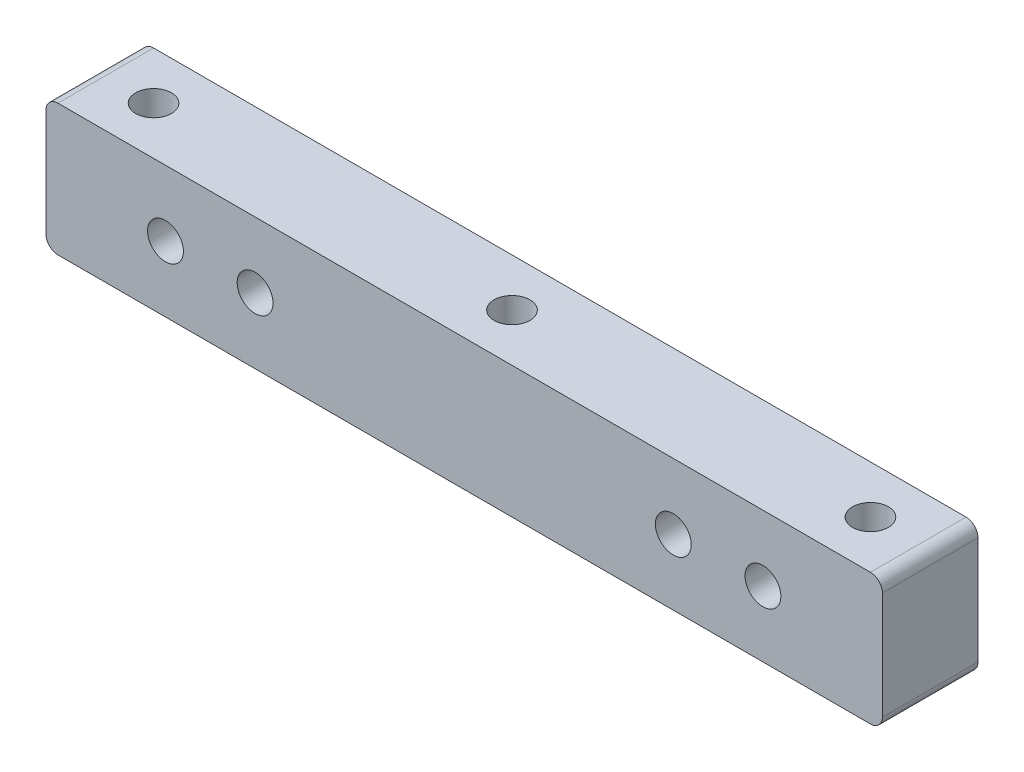
ISO-10303-21;
HEADER;
FILE_DESCRIPTION(('STEP AP214'),'2;1');
FILE_NAME('part.step','',(''),(''),'','','');
FILE_SCHEMA(('AUTOMOTIVE_DESIGN { 1 0 10303 214 1 1 1 1 }'));
ENDSEC;
DATA;
#1=APPLICATION_CONTEXT('core data for automotive mechanical design processes');
#2=APPLICATION_PROTOCOL_DEFINITION('international standard','automotive_design',2000,#1);
#3=PRODUCT_CONTEXT('',#1,'mechanical');
#4=PRODUCT('Part','Part','',(#3));
#5=PRODUCT_RELATED_PRODUCT_CATEGORY('part','',(#4));
#6=PRODUCT_DEFINITION_FORMATION('','',#4);
#7=PRODUCT_DEFINITION_CONTEXT('part definition',#1,'design');
#8=PRODUCT_DEFINITION('design','',#6,#7);
#9=PRODUCT_DEFINITION_SHAPE('','',#8);
#10=(LENGTH_UNIT() NAMED_UNIT(*) SI_UNIT(.MILLI.,.METRE.));
#11=(NAMED_UNIT(*) PLANE_ANGLE_UNIT() SI_UNIT($,.RADIAN.));
#12=(NAMED_UNIT(*) SI_UNIT($,.STERADIAN.) SOLID_ANGLE_UNIT());
#13=UNCERTAINTY_MEASURE_WITH_UNIT(LENGTH_MEASURE(1.E-05),#10,'distance_accuracy_value','');
#14=(GEOMETRIC_REPRESENTATION_CONTEXT(3) GLOBAL_UNCERTAINTY_ASSIGNED_CONTEXT((#13)) GLOBAL_UNIT_ASSIGNED_CONTEXT((#10,
#11,#12)) REPRESENTATION_CONTEXT('',''));
#15=CARTESIAN_POINT('',(0.,0.,0.));
#16=DIRECTION('',(0.,0.,1.));
#17=DIRECTION('',(1.,0.,0.));
#18=AXIS2_PLACEMENT_3D('',#15,#16,#17);
#19=CARTESIAN_POINT('',(70.,11.,16.));
#20=DIRECTION('',(-1.,0.,0.));
#21=DIRECTION('',(0.,0.,1.));
#22=AXIS2_PLACEMENT_3D('',#19,#20,#21);
#23=PLANE('',#22);
#24=DIRECTION('',(0.,1.,0.));
#25=VECTOR('',#24,1.);
#26=CARTESIAN_POINT('',(70.,11.,0.));
#27=LINE('',#26,#25);
#28=CARTESIAN_POINT('',(70.,-9.,0.));
#29=VERTEX_POINT('',#28);
#30=CARTESIAN_POINT('',(70.,9.,0.));
#31=VERTEX_POINT('',#30);
#32=EDGE_CURVE('E168',#29,#31,#27,.T.);
#33=ORIENTED_EDGE('',*,*,#32,.T.);
#34=DIRECTION('',(0.,0.,-1.));
#35=VECTOR('',#34,1.);
#36=CARTESIAN_POINT('',(70.,9.,16.));
#37=LINE('',#36,#35);
#38=CARTESIAN_POINT('',(70.,9.,16.));
#39=VERTEX_POINT('',#38);
#40=EDGE_CURVE('E56',#31,#39,#37,.F.);
#41=ORIENTED_EDGE('',*,*,#40,.T.);
#42=DIRECTION('',(0.,1.,0.));
#43=VECTOR('',#42,1.);
#44=CARTESIAN_POINT('',(70.,11.,16.));
#45=LINE('',#44,#43);
#46=CARTESIAN_POINT('',(70.,-9.,16.));
#47=VERTEX_POINT('',#46);
#48=EDGE_CURVE('E123',#47,#39,#45,.T.);
#49=ORIENTED_EDGE('',*,*,#48,.F.);
#50=DIRECTION('',(0.,0.,-1.));
#51=VECTOR('',#50,1.);
#52=CARTESIAN_POINT('',(70.,-9.,16.));
#53=LINE('',#52,#51);
#54=EDGE_CURVE('E150',#47,#29,#53,.T.);
#55=ORIENTED_EDGE('',*,*,#54,.T.);
#56=EDGE_LOOP('',(#33,#41,#49,#55));
#57=FACE_BOUND('',#56,.T.);
#58=ADVANCED_FACE('F35',(#57),#23,.F.);
#59=CARTESIAN_POINT('',(-70.,11.,16.));
#60=DIRECTION('',(0.,-1.,0.));
#61=DIRECTION('',(0.,0.,-1.));
#62=AXIS2_PLACEMENT_3D('',#59,#60,#61);
#63=PLANE('',#62);
#64=CARTESIAN_POINT('',(60.,11.,7.99999999999999));
#65=DIRECTION('',(0.,1.,0.));
#66=DIRECTION('',(0.,0.,1.));
#67=AXIS2_PLACEMENT_3D('',#64,#65,#66);
#68=CIRCLE('',#67,2.99999999999999);
#69=CARTESIAN_POINT('',(60.,11.,11.));
#70=VERTEX_POINT('',#69);
#71=EDGE_CURVE('E212',#70,#70,#68,.T.);
#72=ORIENTED_EDGE('',*,*,#71,.F.);
#73=EDGE_LOOP('',(#72));
#74=FACE_BOUND('',#73,.T.);
#75=CARTESIAN_POINT('',(-60.,11.,7.99999999999999));
#76=DIRECTION('',(0.,1.,0.));
#77=DIRECTION('',(0.,0.,-1.));
#78=AXIS2_PLACEMENT_3D('',#75,#76,#77);
#79=CIRCLE('',#78,2.99999999999999);
#80=CARTESIAN_POINT('',(-60.,11.,5.));
#81=VERTEX_POINT('',#80);
#82=EDGE_CURVE('E206',#81,#81,#79,.T.);
#83=ORIENTED_EDGE('',*,*,#82,.F.);
#84=EDGE_LOOP('',(#83));
#85=FACE_BOUND('',#84,.T.);
#86=CARTESIAN_POINT('',(0.,11.,7.99999999999999));
#87=DIRECTION('',(0.,1.,0.));
#88=DIRECTION('',(0.,0.,1.));
#89=AXIS2_PLACEMENT_3D('',#86,#87,#88);
#90=CIRCLE('',#89,3.);
#91=CARTESIAN_POINT('',(0.,11.,11.));
#92=VERTEX_POINT('',#91);
#93=EDGE_CURVE('E200',#92,#92,#90,.T.);
#94=ORIENTED_EDGE('',*,*,#93,.F.);
#95=EDGE_LOOP('',(#94));
#96=FACE_BOUND('',#95,.T.);
#97=DIRECTION('',(-1.,0.,0.));
#98=VECTOR('',#97,1.);
#99=CARTESIAN_POINT('',(-70.,11.,16.));
#100=LINE('',#99,#98);
#101=CARTESIAN_POINT('',(68.,11.,16.));
#102=VERTEX_POINT('',#101);
#103=CARTESIAN_POINT('',(-68.,11.,16.));
#104=VERTEX_POINT('',#103);
#105=EDGE_CURVE('E126',#102,#104,#100,.T.);
#106=ORIENTED_EDGE('',*,*,#105,.F.);
#107=DIRECTION('',(0.,0.,-1.));
#108=VECTOR('',#107,1.);
#109=CARTESIAN_POINT('',(68.,11.,16.));
#110=LINE('',#109,#108);
#111=CARTESIAN_POINT('',(68.,11.,0.));
#112=VERTEX_POINT('',#111);
#113=EDGE_CURVE('E144',#102,#112,#110,.T.);
#114=ORIENTED_EDGE('',*,*,#113,.T.);
#115=DIRECTION('',(-1.,0.,0.));
#116=VECTOR('',#115,1.);
#117=CARTESIAN_POINT('',(-70.,11.,0.));
#118=LINE('',#117,#116);
#119=CARTESIAN_POINT('',(-68.,11.,0.));
#120=VERTEX_POINT('',#119);
#121=EDGE_CURVE('E128',#112,#120,#118,.T.);
#122=ORIENTED_EDGE('',*,*,#121,.T.);
#123=DIRECTION('',(0.,0.,-1.));
#124=VECTOR('',#123,1.);
#125=CARTESIAN_POINT('',(-68.,11.,16.));
#126=LINE('',#125,#124);
#127=EDGE_CURVE('E141',#120,#104,#126,.F.);
#128=ORIENTED_EDGE('',*,*,#127,.T.);
#129=EDGE_LOOP('',(#106,#114,#122,#128));
#130=FACE_BOUND('',#129,.T.);
#131=ADVANCED_FACE('F162',(#74,#85,#96,#130),#63,.F.);
#132=CARTESIAN_POINT('',(-70.,11.,16.));
#133=DIRECTION('',(1.,0.,0.));
#134=DIRECTION('',(0.,0.,-1.));
#135=AXIS2_PLACEMENT_3D('',#132,#133,#134);
#136=PLANE('',#135);
#137=DIRECTION('',(0.,-1.,0.));
#138=VECTOR('',#137,1.);
#139=CARTESIAN_POINT('',(-70.,11.,0.));
#140=LINE('',#139,#138);
#141=CARTESIAN_POINT('',(-70.,9.,0.));
#142=VERTEX_POINT('',#141);
#143=CARTESIAN_POINT('',(-70.,-9.,0.));
#144=VERTEX_POINT('',#143);
#145=EDGE_CURVE('E124',#142,#144,#140,.T.);
#146=ORIENTED_EDGE('',*,*,#145,.T.);
#147=DIRECTION('',(0.,0.,-1.));
#148=VECTOR('',#147,1.);
#149=CARTESIAN_POINT('',(-70.,-9.,16.));
#150=LINE('',#149,#148);
#151=CARTESIAN_POINT('',(-70.,-9.,16.));
#152=VERTEX_POINT('',#151);
#153=EDGE_CURVE('E107',#144,#152,#150,.F.);
#154=ORIENTED_EDGE('',*,*,#153,.T.);
#155=DIRECTION('',(0.,-1.,0.));
#156=VECTOR('',#155,1.);
#157=CARTESIAN_POINT('',(-70.,11.,16.));
#158=LINE('',#157,#156);
#159=CARTESIAN_POINT('',(-70.,9.,16.));
#160=VERTEX_POINT('',#159);
#161=EDGE_CURVE('E165',#160,#152,#158,.T.);
#162=ORIENTED_EDGE('',*,*,#161,.F.);
#163=DIRECTION('',(0.,0.,-1.));
#164=VECTOR('',#163,1.);
#165=CARTESIAN_POINT('',(-70.,9.,16.));
#166=LINE('',#165,#164);
#167=EDGE_CURVE('E112',#160,#142,#166,.T.);
#168=ORIENTED_EDGE('',*,*,#167,.T.);
#169=EDGE_LOOP('',(#146,#154,#162,#168));
#170=FACE_BOUND('',#169,.T.);
#171=ADVANCED_FACE('F229',(#170),#136,.F.);
#172=CARTESIAN_POINT('',(-70.,-11.,16.));
#173=DIRECTION('',(0.,1.,0.));
#174=DIRECTION('',(0.,0.,1.));
#175=AXIS2_PLACEMENT_3D('',#172,#173,#174);
#176=PLANE('',#175);
#177=CARTESIAN_POINT('',(60.,-11.,7.99999999999999));
#178=DIRECTION('',(0.,1.,0.));
#179=DIRECTION('',(0.,0.,1.));
#180=AXIS2_PLACEMENT_3D('',#177,#178,#179);
#181=CIRCLE('',#180,2.99999999999999);
#182=CARTESIAN_POINT('',(60.,-11.,11.));
#183=VERTEX_POINT('',#182);
#184=EDGE_CURVE('E209',#183,#183,#181,.T.);
#185=ORIENTED_EDGE('',*,*,#184,.T.);
#186=EDGE_LOOP('',(#185));
#187=FACE_BOUND('',#186,.T.);
#188=CARTESIAN_POINT('',(-60.,-11.,7.99999999999999));
#189=DIRECTION('',(0.,1.,0.));
#190=DIRECTION('',(0.,0.,-1.));
#191=AXIS2_PLACEMENT_3D('',#188,#189,#190);
#192=CIRCLE('',#191,2.99999999999999);
#193=CARTESIAN_POINT('',(-60.,-11.,5.));
#194=VERTEX_POINT('',#193);
#195=EDGE_CURVE('E203',#194,#194,#192,.T.);
#196=ORIENTED_EDGE('',*,*,#195,.T.);
#197=EDGE_LOOP('',(#196));
#198=FACE_BOUND('',#197,.T.);
#199=CARTESIAN_POINT('',(0.,-11.,7.99999999999999));
#200=DIRECTION('',(0.,1.,0.));
#201=DIRECTION('',(0.,0.,1.));
#202=AXIS2_PLACEMENT_3D('',#199,#200,#201);
#203=CIRCLE('',#202,3.);
#204=CARTESIAN_POINT('',(0.,-11.,11.));
#205=VERTEX_POINT('',#204);
#206=EDGE_CURVE('E199',#205,#205,#203,.T.);
#207=ORIENTED_EDGE('',*,*,#206,.T.);
#208=EDGE_LOOP('',(#207));
#209=FACE_BOUND('',#208,.T.);
#210=DIRECTION('',(1.,0.,0.));
#211=VECTOR('',#210,1.);
#212=CARTESIAN_POINT('',(-70.,-11.,0.));
#213=LINE('',#212,#211);
#214=CARTESIAN_POINT('',(-68.,-11.,0.));
#215=VERTEX_POINT('',#214);
#216=CARTESIAN_POINT('',(68.,-11.,0.));
#217=VERTEX_POINT('',#216);
#218=EDGE_CURVE('E116',#215,#217,#213,.T.);
#219=ORIENTED_EDGE('',*,*,#218,.T.);
#220=DIRECTION('',(0.,0.,-1.));
#221=VECTOR('',#220,1.);
#222=CARTESIAN_POINT('',(68.,-11.,16.));
#223=LINE('',#222,#221);
#224=CARTESIAN_POINT('',(68.,-11.,16.));
#225=VERTEX_POINT('',#224);
#226=EDGE_CURVE('E12',#217,#225,#223,.F.);
#227=ORIENTED_EDGE('',*,*,#226,.T.);
#228=DIRECTION('',(1.,0.,0.));
#229=VECTOR('',#228,1.);
#230=CARTESIAN_POINT('',(-70.,-11.,16.));
#231=LINE('',#230,#229);
#232=CARTESIAN_POINT('',(-68.,-11.,16.));
#233=VERTEX_POINT('',#232);
#234=EDGE_CURVE('E117',#233,#225,#231,.T.);
#235=ORIENTED_EDGE('',*,*,#234,.F.);
#236=DIRECTION('',(0.,0.,-1.));
#237=VECTOR('',#236,1.);
#238=CARTESIAN_POINT('',(-68.,-11.,16.));
#239=LINE('',#238,#237);
#240=EDGE_CURVE('E106',#233,#215,#239,.T.);
#241=ORIENTED_EDGE('',*,*,#240,.T.);
#242=EDGE_LOOP('',(#219,#227,#235,#241));
#243=FACE_BOUND('',#242,.T.);
#244=ADVANCED_FACE('F115',(#187,#198,#209,#243),#176,.F.);
#245=CARTESIAN_POINT('',(0.,0.,16.));
#246=DIRECTION('',(0.,0.,1.));
#247=DIRECTION('',(1.,0.,0.));
#248=AXIS2_PLACEMENT_3D('',#245,#246,#247);
#249=PLANE('',#248);
#250=CARTESIAN_POINT('',(-50.,-2.09488880330588E-13,16.));
#251=DIRECTION('',(0.,0.,1.));
#252=DIRECTION('',(-1.,0.,0.));
#253=AXIS2_PLACEMENT_3D('',#250,#251,#252);
#254=CIRCLE('',#253,2.99999999999999);
#255=CARTESIAN_POINT('',(-52.9999999999999,-2.09488880330588E-13,16.));
#256=VERTEX_POINT('',#255);
#257=EDGE_CURVE('E196',#256,#256,#254,.T.);
#258=ORIENTED_EDGE('',*,*,#257,.F.);
#259=EDGE_LOOP('',(#258));
#260=FACE_BOUND('',#259,.T.);
#261=CARTESIAN_POINT('',(-35.,-1.04744440165294E-13,16.));
#262=DIRECTION('',(0.,0.,1.));
#263=DIRECTION('',(-1.,0.,0.));
#264=AXIS2_PLACEMENT_3D('',#261,#262,#263);
#265=CIRCLE('',#264,2.99999999999999);
#266=CARTESIAN_POINT('',(-37.9999999999999,-1.04744440165294E-13,16.));
#267=VERTEX_POINT('',#266);
#268=EDGE_CURVE('E190',#267,#267,#265,.T.);
#269=ORIENTED_EDGE('',*,*,#268,.F.);
#270=EDGE_LOOP('',(#269));
#271=FACE_BOUND('',#270,.T.);
#272=CARTESIAN_POINT('',(50.,-1.04744440165294E-13,16.));
#273=DIRECTION('',(0.,0.,1.));
#274=DIRECTION('',(1.,0.,0.));
#275=AXIS2_PLACEMENT_3D('',#272,#273,#274);
#276=CIRCLE('',#275,2.99999999999999);
#277=CARTESIAN_POINT('',(53.,-1.04744440165294E-13,16.));
#278=VERTEX_POINT('',#277);
#279=EDGE_CURVE('E184',#278,#278,#276,.T.);
#280=ORIENTED_EDGE('',*,*,#279,.F.);
#281=EDGE_LOOP('',(#280));
#282=FACE_BOUND('',#281,.T.);
#283=CARTESIAN_POINT('',(35.,-1.04744440165294E-13,16.));
#284=DIRECTION('',(0.,0.,1.));
#285=DIRECTION('',(1.,0.,0.));
#286=AXIS2_PLACEMENT_3D('',#283,#284,#285);
#287=CIRCLE('',#286,2.99999999999999);
#288=CARTESIAN_POINT('',(38.,-1.04744440165294E-13,16.));
#289=VERTEX_POINT('',#288);
#290=EDGE_CURVE('E173',#289,#289,#287,.T.);
#291=ORIENTED_EDGE('',*,*,#290,.F.);
#292=EDGE_LOOP('',(#291));
#293=FACE_BOUND('',#292,.T.);
#294=ORIENTED_EDGE('',*,*,#48,.T.);
#295=CARTESIAN_POINT('',(68.,9.,16.));
#296=DIRECTION('',(0.,0.,1.));
#297=DIRECTION('',(1.,0.,0.));
#298=AXIS2_PLACEMENT_3D('',#295,#296,#297);
#299=CIRCLE('',#298,2.);
#300=EDGE_CURVE('E43',#39,#102,#299,.T.);
#301=ORIENTED_EDGE('',*,*,#300,.T.);
#302=ORIENTED_EDGE('',*,*,#105,.T.);
#303=CARTESIAN_POINT('',(-68.,9.,16.));
#304=DIRECTION('',(0.,0.,1.));
#305=DIRECTION('',(1.,0.,0.));
#306=AXIS2_PLACEMENT_3D('',#303,#304,#305);
#307=CIRCLE('',#306,2.);
#308=EDGE_CURVE('E137',#104,#160,#307,.T.);
#309=ORIENTED_EDGE('',*,*,#308,.T.);
#310=ORIENTED_EDGE('',*,*,#161,.T.);
#311=CARTESIAN_POINT('',(-68.,-9.,16.));
#312=DIRECTION('',(0.,0.,1.));
#313=DIRECTION('',(1.,0.,0.));
#314=AXIS2_PLACEMENT_3D('',#311,#312,#313);
#315=CIRCLE('',#314,2.);
#316=EDGE_CURVE('E139',#152,#233,#315,.T.);
#317=ORIENTED_EDGE('',*,*,#316,.T.);
#318=ORIENTED_EDGE('',*,*,#234,.T.);
#319=CARTESIAN_POINT('',(68.,-9.,16.));
#320=DIRECTION('',(0.,0.,1.));
#321=DIRECTION('',(1.,0.,0.));
#322=AXIS2_PLACEMENT_3D('',#319,#320,#321);
#323=CIRCLE('',#322,2.);
#324=EDGE_CURVE('E154',#225,#47,#323,.T.);
#325=ORIENTED_EDGE('',*,*,#324,.T.);
#326=EDGE_LOOP('',(#294,#301,#302,#309,#310,#317,#318,#325));
#327=FACE_BOUND('',#326,.T.);
#328=ADVANCED_FACE('F158',(#260,#271,#282,#293,#327),#249,.T.);
#329=CARTESIAN_POINT('',(0.,0.,0.));
#330=DIRECTION('',(0.,0.,1.));
#331=DIRECTION('',(1.,0.,0.));
#332=AXIS2_PLACEMENT_3D('',#329,#330,#331);
#333=PLANE('',#332);
#334=ORIENTED_EDGE('',*,*,#121,.F.);
#335=CARTESIAN_POINT('',(68.,9.,0.));
#336=DIRECTION('',(0.,0.,1.));
#337=DIRECTION('',(1.,0.,0.));
#338=AXIS2_PLACEMENT_3D('',#335,#336,#337);
#339=CIRCLE('',#338,2.);
#340=EDGE_CURVE('E148',#112,#31,#339,.F.);
#341=ORIENTED_EDGE('',*,*,#340,.T.);
#342=ORIENTED_EDGE('',*,*,#32,.F.);
#343=CARTESIAN_POINT('',(68.,-9.,0.));
#344=DIRECTION('',(0.,0.,1.));
#345=DIRECTION('',(1.,0.,0.));
#346=AXIS2_PLACEMENT_3D('',#343,#344,#345);
#347=CIRCLE('',#346,2.);
#348=EDGE_CURVE('E122',#29,#217,#347,.F.);
#349=ORIENTED_EDGE('',*,*,#348,.T.);
#350=ORIENTED_EDGE('',*,*,#218,.F.);
#351=CARTESIAN_POINT('',(-68.,-9.,0.));
#352=DIRECTION('',(0.,0.,1.));
#353=DIRECTION('',(1.,0.,0.));
#354=AXIS2_PLACEMENT_3D('',#351,#352,#353);
#355=CIRCLE('',#354,2.);
#356=EDGE_CURVE('E102',#215,#144,#355,.F.);
#357=ORIENTED_EDGE('',*,*,#356,.T.);
#358=ORIENTED_EDGE('',*,*,#145,.F.);
#359=CARTESIAN_POINT('',(-68.,9.,0.));
#360=DIRECTION('',(0.,0.,1.));
#361=DIRECTION('',(1.,0.,0.));
#362=AXIS2_PLACEMENT_3D('',#359,#360,#361);
#363=CIRCLE('',#362,2.);
#364=EDGE_CURVE('E113',#142,#120,#363,.F.);
#365=ORIENTED_EDGE('',*,*,#364,.T.);
#366=EDGE_LOOP('',(#334,#341,#342,#349,#350,#357,#358,#365));
#367=FACE_BOUND('',#366,.T.);
#368=ADVANCED_FACE('F120',(#367),#333,.F.);
#369=CARTESIAN_POINT('',(35.,-1.04744440165294E-13,-8.48528137423855));
#370=DIRECTION('',(0.,0.,1.));
#371=DIRECTION('',(1.,0.,0.));
#372=AXIS2_PLACEMENT_3D('',#369,#370,#371);
#373=CYLINDRICAL_SURFACE('',#372,2.99999999999999);
#374=CARTESIAN_POINT('',(35.,-1.04744440165294E-13,0.200000000000001));
#375=DIRECTION('',(0.,0.,1.));
#376=DIRECTION('',(1.,0.,0.));
#377=AXIS2_PLACEMENT_3D('',#374,#375,#376);
#378=CIRCLE('',#377,2.99999999999999);
#379=CARTESIAN_POINT('',(38.,-1.04744440165294E-13,0.200000000000001));
#380=VERTEX_POINT('',#379);
#381=EDGE_CURVE('E170',#380,#380,#378,.F.);
#382=ORIENTED_EDGE('',*,*,#381,.T.);
#383=EDGE_LOOP('',(#382));
#384=FACE_BOUND('',#383,.T.);
#385=ORIENTED_EDGE('',*,*,#290,.T.);
#386=EDGE_LOOP('',(#385));
#387=FACE_BOUND('',#386,.T.);
#388=ADVANCED_FACE('F280',(#384,#387),#373,.F.);
#389=CARTESIAN_POINT('',(0.,0.,0.2));
#390=DIRECTION('',(0.,0.,1.));
#391=DIRECTION('',(1.,0.,0.));
#392=AXIS2_PLACEMENT_3D('',#389,#390,#391);
#393=PLANE('',#392);
#394=ORIENTED_EDGE('',*,*,#381,.F.);
#395=EDGE_LOOP('',(#394));
#396=FACE_BOUND('',#395,.T.);
#397=ADVANCED_FACE('F286',(#396),#393,.T.);
#398=CARTESIAN_POINT('',(50.,-1.04744440165294E-13,-8.48528137423855));
#399=DIRECTION('',(0.,0.,1.));
#400=DIRECTION('',(1.,0.,0.));
#401=AXIS2_PLACEMENT_3D('',#398,#399,#400);
#402=CYLINDRICAL_SURFACE('',#401,2.99999999999999);
#403=CARTESIAN_POINT('',(50.,-1.04744440165294E-13,0.200000000000001));
#404=DIRECTION('',(0.,0.,1.));
#405=DIRECTION('',(1.,0.,0.));
#406=AXIS2_PLACEMENT_3D('',#403,#404,#405);
#407=CIRCLE('',#406,2.99999999999999);
#408=CARTESIAN_POINT('',(53.,-1.04744440165294E-13,0.200000000000001));
#409=VERTEX_POINT('',#408);
#410=EDGE_CURVE('E181',#409,#409,#407,.F.);
#411=ORIENTED_EDGE('',*,*,#410,.T.);
#412=EDGE_LOOP('',(#411));
#413=FACE_BOUND('',#412,.T.);
#414=ORIENTED_EDGE('',*,*,#279,.T.);
#415=EDGE_LOOP('',(#414));
#416=FACE_BOUND('',#415,.T.);
#417=ADVANCED_FACE('F290',(#413,#416),#402,.F.);
#418=CARTESIAN_POINT('',(0.,0.,0.2));
#419=DIRECTION('',(0.,0.,1.));
#420=DIRECTION('',(1.,0.,0.));
#421=AXIS2_PLACEMENT_3D('',#418,#419,#420);
#422=PLANE('',#421);
#423=ORIENTED_EDGE('',*,*,#410,.F.);
#424=EDGE_LOOP('',(#423));
#425=FACE_BOUND('',#424,.T.);
#426=ADVANCED_FACE('F294',(#425),#422,.T.);
#427=CARTESIAN_POINT('',(-35.,-1.04744440165294E-13,-8.48528137423855));
#428=DIRECTION('',(0.,0.,1.));
#429=DIRECTION('',(1.,0.,0.));
#430=AXIS2_PLACEMENT_3D('',#427,#428,#429);
#431=CYLINDRICAL_SURFACE('',#430,2.99999999999999);
#432=CARTESIAN_POINT('',(-35.,-1.04744440165294E-13,0.200000000000001));
#433=DIRECTION('',(0.,0.,1.));
#434=DIRECTION('',(1.,0.,0.));
#435=AXIS2_PLACEMENT_3D('',#432,#433,#434);
#436=CIRCLE('',#435,2.99999999999999);
#437=CARTESIAN_POINT('',(-32.,-1.04744440165294E-13,0.200000000000001));
#438=VERTEX_POINT('',#437);
#439=EDGE_CURVE('E187',#438,#438,#436,.F.);
#440=ORIENTED_EDGE('',*,*,#439,.T.);
#441=EDGE_LOOP('',(#440));
#442=FACE_BOUND('',#441,.T.);
#443=ORIENTED_EDGE('',*,*,#268,.T.);
#444=EDGE_LOOP('',(#443));
#445=FACE_BOUND('',#444,.T.);
#446=ADVANCED_FACE('F298',(#442,#445),#431,.F.);
#447=CARTESIAN_POINT('',(0.,0.,0.2));
#448=DIRECTION('',(0.,0.,1.));
#449=DIRECTION('',(1.,0.,0.));
#450=AXIS2_PLACEMENT_3D('',#447,#448,#449);
#451=PLANE('',#450);
#452=ORIENTED_EDGE('',*,*,#439,.F.);
#453=EDGE_LOOP('',(#452));
#454=FACE_BOUND('',#453,.T.);
#455=ADVANCED_FACE('F302',(#454),#451,.T.);
#456=CARTESIAN_POINT('',(-50.,-2.09488880330588E-13,-8.48528137423855));
#457=DIRECTION('',(0.,0.,1.));
#458=DIRECTION('',(1.,0.,0.));
#459=AXIS2_PLACEMENT_3D('',#456,#457,#458);
#460=CYLINDRICAL_SURFACE('',#459,2.99999999999999);
#461=CARTESIAN_POINT('',(-50.,-2.09488880330588E-13,0.200000000000001));
#462=DIRECTION('',(0.,0.,1.));
#463=DIRECTION('',(1.,0.,0.));
#464=AXIS2_PLACEMENT_3D('',#461,#462,#463);
#465=CIRCLE('',#464,2.99999999999999);
#466=CARTESIAN_POINT('',(-47.,-2.09488880330588E-13,0.200000000000001));
#467=VERTEX_POINT('',#466);
#468=EDGE_CURVE('E193',#467,#467,#465,.F.);
#469=ORIENTED_EDGE('',*,*,#468,.T.);
#470=EDGE_LOOP('',(#469));
#471=FACE_BOUND('',#470,.T.);
#472=ORIENTED_EDGE('',*,*,#257,.T.);
#473=EDGE_LOOP('',(#472));
#474=FACE_BOUND('',#473,.T.);
#475=ADVANCED_FACE('F246',(#471,#474),#460,.F.);
#476=CARTESIAN_POINT('',(0.,0.,0.2));
#477=DIRECTION('',(0.,0.,1.));
#478=DIRECTION('',(1.,0.,0.));
#479=AXIS2_PLACEMENT_3D('',#476,#477,#478);
#480=PLANE('',#479);
#481=ORIENTED_EDGE('',*,*,#468,.F.);
#482=EDGE_LOOP('',(#481));
#483=FACE_BOUND('',#482,.T.);
#484=ADVANCED_FACE('F237',(#483),#480,.T.);
#485=CARTESIAN_POINT('',(0.,-11.,7.99999999999999));
#486=DIRECTION('',(0.,1.,0.));
#487=DIRECTION('',(0.,0.,1.));
#488=AXIS2_PLACEMENT_3D('',#485,#486,#487);
#489=CYLINDRICAL_SURFACE('',#488,3.);
#490=ORIENTED_EDGE('',*,*,#206,.F.);
#491=EDGE_LOOP('',(#490));
#492=FACE_BOUND('',#491,.T.);
#493=ORIENTED_EDGE('',*,*,#93,.T.);
#494=EDGE_LOOP('',(#493));
#495=FACE_BOUND('',#494,.T.);
#496=ADVANCED_FACE('F235',(#492,#495),#489,.F.);
#497=CARTESIAN_POINT('',(-60.,-11.,7.99999999999999));
#498=DIRECTION('',(0.,1.,0.));
#499=DIRECTION('',(0.,0.,1.));
#500=AXIS2_PLACEMENT_3D('',#497,#498,#499);
#501=CYLINDRICAL_SURFACE('',#500,2.99999999999999);
#502=ORIENTED_EDGE('',*,*,#195,.F.);
#503=EDGE_LOOP('',(#502));
#504=FACE_BOUND('',#503,.T.);
#505=ORIENTED_EDGE('',*,*,#82,.T.);
#506=EDGE_LOOP('',(#505));
#507=FACE_BOUND('',#506,.T.);
#508=ADVANCED_FACE('F223',(#504,#507),#501,.F.);
#509=CARTESIAN_POINT('',(60.,-11.,7.99999999999999));
#510=DIRECTION('',(0.,1.,0.));
#511=DIRECTION('',(0.,0.,1.));
#512=AXIS2_PLACEMENT_3D('',#509,#510,#511);
#513=CYLINDRICAL_SURFACE('',#512,2.99999999999999);
#514=ORIENTED_EDGE('',*,*,#184,.F.);
#515=EDGE_LOOP('',(#514));
#516=FACE_BOUND('',#515,.T.);
#517=ORIENTED_EDGE('',*,*,#71,.T.);
#518=EDGE_LOOP('',(#517));
#519=FACE_BOUND('',#518,.T.);
#520=ADVANCED_FACE('F220',(#516,#519),#513,.F.);
#521=CARTESIAN_POINT('',(-68.,-9.,16.));
#522=DIRECTION('',(0.,0.,-1.));
#523=DIRECTION('',(-1.,0.,0.));
#524=AXIS2_PLACEMENT_3D('',#521,#522,#523);
#525=CYLINDRICAL_SURFACE('',#524,2.);
#526=ORIENTED_EDGE('',*,*,#316,.F.);
#527=ORIENTED_EDGE('',*,*,#153,.F.);
#528=ORIENTED_EDGE('',*,*,#356,.F.);
#529=ORIENTED_EDGE('',*,*,#240,.F.);
#530=EDGE_LOOP('',(#526,#527,#528,#529));
#531=FACE_BOUND('',#530,.T.);
#532=ADVANCED_FACE('F105',(#531),#525,.T.);
#533=CARTESIAN_POINT('',(-68.,9.,16.));
#534=DIRECTION('',(0.,0.,-1.));
#535=DIRECTION('',(-1.,0.,0.));
#536=AXIS2_PLACEMENT_3D('',#533,#534,#535);
#537=CYLINDRICAL_SURFACE('',#536,2.);
#538=ORIENTED_EDGE('',*,*,#308,.F.);
#539=ORIENTED_EDGE('',*,*,#127,.F.);
#540=ORIENTED_EDGE('',*,*,#364,.F.);
#541=ORIENTED_EDGE('',*,*,#167,.F.);
#542=EDGE_LOOP('',(#538,#539,#540,#541));
#543=FACE_BOUND('',#542,.T.);
#544=ADVANCED_FACE('F258',(#543),#537,.T.);
#545=CARTESIAN_POINT('',(68.,9.,16.));
#546=DIRECTION('',(0.,0.,-1.));
#547=DIRECTION('',(-1.,0.,0.));
#548=AXIS2_PLACEMENT_3D('',#545,#546,#547);
#549=CYLINDRICAL_SURFACE('',#548,2.);
#550=ORIENTED_EDGE('',*,*,#300,.F.);
#551=ORIENTED_EDGE('',*,*,#40,.F.);
#552=ORIENTED_EDGE('',*,*,#340,.F.);
#553=ORIENTED_EDGE('',*,*,#113,.F.);
#554=EDGE_LOOP('',(#550,#551,#552,#553));
#555=FACE_BOUND('',#554,.T.);
#556=ADVANCED_FACE('F167',(#555),#549,.T.);
#557=CARTESIAN_POINT('',(68.,-9.,16.));
#558=DIRECTION('',(0.,0.,-1.));
#559=DIRECTION('',(-1.,0.,0.));
#560=AXIS2_PLACEMENT_3D('',#557,#558,#559);
#561=CYLINDRICAL_SURFACE('',#560,2.);
#562=ORIENTED_EDGE('',*,*,#324,.F.);
#563=ORIENTED_EDGE('',*,*,#226,.F.);
#564=ORIENTED_EDGE('',*,*,#348,.F.);
#565=ORIENTED_EDGE('',*,*,#54,.F.);
#566=EDGE_LOOP('',(#562,#563,#564,#565));
#567=FACE_BOUND('',#566,.T.);
#568=ADVANCED_FACE('F37',(#567),#561,.T.);
#569=CLOSED_SHELL('',(#58,#131,#171,#244,#328,#368,#388,#397,#417,#426,#446,#455,#475,#484,#496,
#508,#520,#532,#544,#556,#568));
#570=MANIFOLD_SOLID_BREP('B2',#569);
#571=ADVANCED_BREP_SHAPE_REPRESENTATION('',(#18,#570),#14);
#572=SHAPE_DEFINITION_REPRESENTATION(#9,#571);
ENDSEC;
END-ISO-10303-21;
